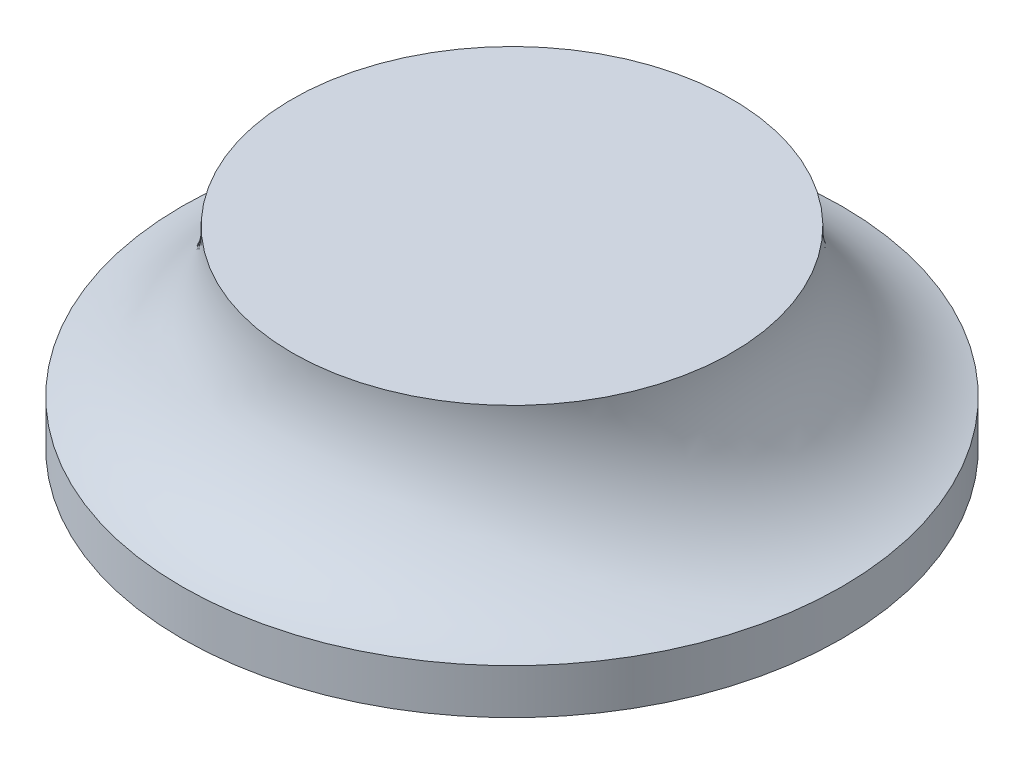
ISO-10303-21;
HEADER;
FILE_DESCRIPTION(('STEP AP214'),'2;1');
FILE_NAME('part.step','',(''),(''),'','','');
FILE_SCHEMA(('AUTOMOTIVE_DESIGN { 1 0 10303 214 1 1 1 1 }'));
ENDSEC;
DATA;
#1=APPLICATION_CONTEXT('core data for automotive mechanical design processes');
#2=APPLICATION_PROTOCOL_DEFINITION('international standard','automotive_design',2000,#1);
#3=PRODUCT_CONTEXT('',#1,'mechanical');
#4=PRODUCT('Part','Part','',(#3));
#5=PRODUCT_RELATED_PRODUCT_CATEGORY('part','',(#4));
#6=PRODUCT_DEFINITION_FORMATION('','',#4);
#7=PRODUCT_DEFINITION_CONTEXT('part definition',#1,'design');
#8=PRODUCT_DEFINITION('design','',#6,#7);
#9=PRODUCT_DEFINITION_SHAPE('','',#8);
#10=(LENGTH_UNIT() NAMED_UNIT(*) SI_UNIT(.MILLI.,.METRE.));
#11=(NAMED_UNIT(*) PLANE_ANGLE_UNIT() SI_UNIT($,.RADIAN.));
#12=(NAMED_UNIT(*) SI_UNIT($,.STERADIAN.) SOLID_ANGLE_UNIT());
#13=UNCERTAINTY_MEASURE_WITH_UNIT(LENGTH_MEASURE(1.E-05),#10,'distance_accuracy_value','');
#14=(GEOMETRIC_REPRESENTATION_CONTEXT(3) GLOBAL_UNCERTAINTY_ASSIGNED_CONTEXT((#13)) GLOBAL_UNIT_ASSIGNED_CONTEXT((#10,
#11,#12)) REPRESENTATION_CONTEXT('',''));
#15=CARTESIAN_POINT('',(0.,0.,0.));
#16=DIRECTION('',(0.,0.,1.));
#17=DIRECTION('',(1.,0.,0.));
#18=AXIS2_PLACEMENT_3D('',#15,#16,#17);
#19=CARTESIAN_POINT('',(-0.15,0.0876506024096386,0.));
#20=DIRECTION('',(0.,1.,0.));
#21=DIRECTION('',(0.,0.,1.));
#22=AXIS2_PLACEMENT_3D('',#19,#20,#21);
#23=CYLINDRICAL_SURFACE('',#22,0.3);
#24=CARTESIAN_POINT('',(-0.15,-0.046695245416497,0.));
#25=DIRECTION('',(0.,1.,0.));
#26=DIRECTION('',(0.,0.,1.));
#27=AXIS2_PLACEMENT_3D('',#24,#25,#26);
#28=CIRCLE('',#27,0.3);
#29=CARTESIAN_POINT('',(-0.15,-0.046695245416497,0.3));
#30=VERTEX_POINT('',#29);
#31=EDGE_CURVE('E10',#30,#30,#28,.T.);
#32=ORIENTED_EDGE('',*,*,#31,.F.);
#33=EDGE_LOOP('',(#32));
#34=FACE_BOUND('',#33,.T.);
#35=CARTESIAN_POINT('',(-0.15,-0.0876506024096386,0.));
#36=DIRECTION('',(0.,1.,0.));
#37=DIRECTION('',(0.,0.,1.));
#38=AXIS2_PLACEMENT_3D('',#35,#36,#37);
#39=CIRCLE('',#38,0.3);
#40=CARTESIAN_POINT('',(-0.15,-0.0876506024096386,0.3));
#41=VERTEX_POINT('',#40);
#42=EDGE_CURVE('E41',#41,#41,#39,.T.);
#43=ORIENTED_EDGE('',*,*,#42,.T.);
#44=EDGE_LOOP('',(#43));
#45=FACE_BOUND('',#44,.T.);
#46=ADVANCED_FACE('F31',(#34,#45),#23,.T.);
#47=CARTESIAN_POINT('',(-0.15,0.0832055507444887,0.));
#48=DIRECTION('',(0.,1.,0.));
#49=DIRECTION('',(0.,0.,1.));
#50=AXIS2_PLACEMENT_3D('',#47,#48,#49);
#51=TOROIDAL_SURFACE('',#50,0.33427229179476,0.134345847826136);
#52=CARTESIAN_POINT('',(-0.15,0.0876506024096386,0.));
#53=DIRECTION('',(0.,1.,0.));
#54=DIRECTION('',(0.,0.,1.));
#55=AXIS2_PLACEMENT_3D('',#52,#53,#54);
#56=CIRCLE('',#55,0.2);
#57=CARTESIAN_POINT('',(-0.15,0.0876506024096386,0.2));
#58=VERTEX_POINT('',#57);
#59=EDGE_CURVE('E37',#58,#58,#56,.T.);
#60=ORIENTED_EDGE('',*,*,#59,.F.);
#61=EDGE_LOOP('',(#60));
#62=FACE_BOUND('',#61,.T.);
#63=ORIENTED_EDGE('',*,*,#31,.T.);
#64=EDGE_LOOP('',(#63));
#65=FACE_BOUND('',#64,.T.);
#66=ADVANCED_FACE('F56',(#62,#65),#51,.F.);
#67=CARTESIAN_POINT('',(-0.15,0.0876506024096386,0.));
#68=DIRECTION('',(0.,-1.,0.));
#69=DIRECTION('',(0.,0.,-1.));
#70=AXIS2_PLACEMENT_3D('',#67,#68,#69);
#71=PLANE('',#70);
#72=ORIENTED_EDGE('',*,*,#59,.T.);
#73=EDGE_LOOP('',(#72));
#74=FACE_BOUND('',#73,.T.);
#75=ADVANCED_FACE('F51',(#74),#71,.F.);
#76=CARTESIAN_POINT('',(-0.15,-0.0876506024096386,0.));
#77=DIRECTION('',(0.,1.,0.));
#78=DIRECTION('',(0.,0.,1.));
#79=AXIS2_PLACEMENT_3D('',#76,#77,#78);
#80=PLANE('',#79);
#81=ORIENTED_EDGE('',*,*,#42,.F.);
#82=EDGE_LOOP('',(#81));
#83=FACE_BOUND('',#82,.T.);
#84=ADVANCED_FACE('F49',(#83),#80,.F.);
#85=CLOSED_SHELL('',(#46,#66,#75,#84));
#86=MANIFOLD_SOLID_BREP('B2',#85);
#87=ADVANCED_BREP_SHAPE_REPRESENTATION('',(#18,#86),#14);
#88=SHAPE_DEFINITION_REPRESENTATION(#9,#87);
ENDSEC;
END-ISO-10303-21;
